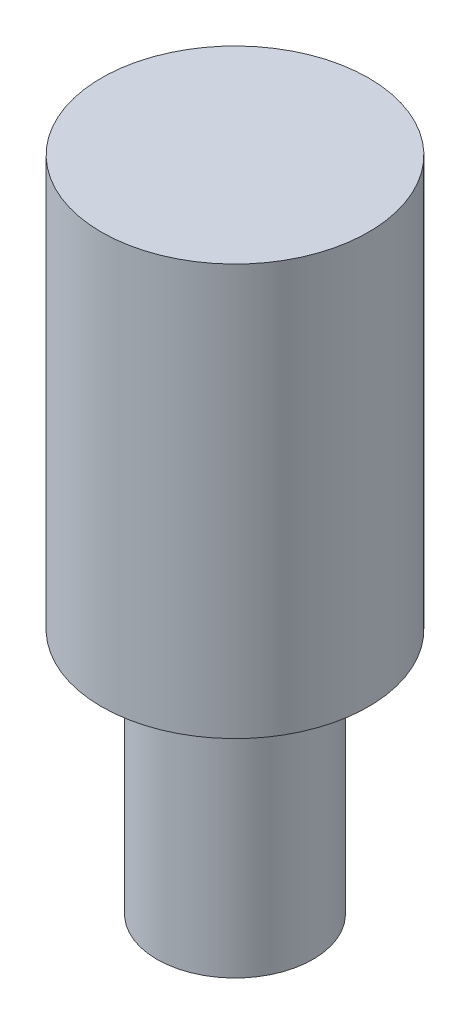
ISO-10303-21;
HEADER;
FILE_DESCRIPTION(('STEP AP214'),'2;1');
FILE_NAME('part.step','',(''),(''),'','','');
FILE_SCHEMA(('AUTOMOTIVE_DESIGN { 1 0 10303 214 1 1 1 1 }'));
ENDSEC;
DATA;
#1=APPLICATION_CONTEXT('core data for automotive mechanical design processes');
#2=APPLICATION_PROTOCOL_DEFINITION('international standard','automotive_design',2000,#1);
#3=PRODUCT_CONTEXT('',#1,'mechanical');
#4=PRODUCT('Part','Part','',(#3));
#5=PRODUCT_RELATED_PRODUCT_CATEGORY('part','',(#4));
#6=PRODUCT_DEFINITION_FORMATION('','',#4);
#7=PRODUCT_DEFINITION_CONTEXT('part definition',#1,'design');
#8=PRODUCT_DEFINITION('design','',#6,#7);
#9=PRODUCT_DEFINITION_SHAPE('','',#8);
#10=(LENGTH_UNIT() NAMED_UNIT(*) SI_UNIT(.MILLI.,.METRE.));
#11=(NAMED_UNIT(*) PLANE_ANGLE_UNIT() SI_UNIT($,.RADIAN.));
#12=(NAMED_UNIT(*) SI_UNIT($,.STERADIAN.) SOLID_ANGLE_UNIT());
#13=UNCERTAINTY_MEASURE_WITH_UNIT(LENGTH_MEASURE(1.E-05),#10,'distance_accuracy_value','');
#14=(GEOMETRIC_REPRESENTATION_CONTEXT(3) GLOBAL_UNCERTAINTY_ASSIGNED_CONTEXT((#13)) GLOBAL_UNIT_ASSIGNED_CONTEXT((#10,
#11,#12)) REPRESENTATION_CONTEXT('',''));
#15=CARTESIAN_POINT('',(0.,0.,0.));
#16=DIRECTION('',(0.,0.,1.));
#17=DIRECTION('',(1.,0.,0.));
#18=AXIS2_PLACEMENT_3D('',#15,#16,#17);
#19=CARTESIAN_POINT('',(0.,6.,0.));
#20=DIRECTION('',(0.,-1.,0.));
#21=DIRECTION('',(0.,0.,-1.));
#22=AXIS2_PLACEMENT_3D('',#19,#20,#21);
#23=CYLINDRICAL_SURFACE('',#22,1.9);
#24=CARTESIAN_POINT('',(0.,6.,0.));
#25=DIRECTION('',(0.,1.,0.));
#26=DIRECTION('',(0.,0.,1.));
#27=AXIS2_PLACEMENT_3D('',#24,#25,#26);
#28=CIRCLE('',#27,1.9);
#29=CARTESIAN_POINT('',(0.,6.,1.9));
#30=VERTEX_POINT('',#29);
#31=EDGE_CURVE('E10',#30,#30,#28,.T.);
#32=ORIENTED_EDGE('',*,*,#31,.F.);
#33=EDGE_LOOP('',(#32));
#34=FACE_BOUND('',#33,.T.);
#35=CARTESIAN_POINT('',(0.,0.,0.));
#36=DIRECTION('',(0.,1.,0.));
#37=DIRECTION('',(0.,0.,1.));
#38=AXIS2_PLACEMENT_3D('',#35,#36,#37);
#39=CIRCLE('',#38,1.9);
#40=CARTESIAN_POINT('',(0.,0.,1.9));
#41=VERTEX_POINT('',#40);
#42=EDGE_CURVE('E46',#41,#41,#39,.T.);
#43=ORIENTED_EDGE('',*,*,#42,.T.);
#44=EDGE_LOOP('',(#43));
#45=FACE_BOUND('',#44,.T.);
#46=ADVANCED_FACE('F43',(#34,#45),#23,.T.);
#47=CARTESIAN_POINT('',(0.,0.,0.));
#48=DIRECTION('',(0.,1.,0.));
#49=DIRECTION('',(0.,0.,1.));
#50=AXIS2_PLACEMENT_3D('',#47,#48,#49);
#51=PLANE('',#50);
#52=ORIENTED_EDGE('',*,*,#42,.F.);
#53=EDGE_LOOP('',(#52));
#54=FACE_BOUND('',#53,.T.);
#55=ADVANCED_FACE('F70',(#54),#51,.F.);
#56=CARTESIAN_POINT('',(0.,16.,0.));
#57=DIRECTION('',(0.,-1.,0.));
#58=DIRECTION('',(0.,0.,-1.));
#59=AXIS2_PLACEMENT_3D('',#56,#57,#58);
#60=CYLINDRICAL_SURFACE('',#59,3.25);
#61=CARTESIAN_POINT('',(0.,16.,0.));
#62=DIRECTION('',(0.,1.,0.));
#63=DIRECTION('',(0.,0.,1.));
#64=AXIS2_PLACEMENT_3D('',#61,#62,#63);
#65=CIRCLE('',#64,3.25);
#66=CARTESIAN_POINT('',(0.,16.,3.25));
#67=VERTEX_POINT('',#66);
#68=EDGE_CURVE('E55',#67,#67,#65,.T.);
#69=ORIENTED_EDGE('',*,*,#68,.F.);
#70=EDGE_LOOP('',(#69));
#71=FACE_BOUND('',#70,.T.);
#72=CARTESIAN_POINT('',(0.,6.,0.));
#73=DIRECTION('',(0.,1.,0.));
#74=DIRECTION('',(0.,0.,1.));
#75=AXIS2_PLACEMENT_3D('',#72,#73,#74);
#76=CIRCLE('',#75,3.25);
#77=CARTESIAN_POINT('',(0.,6.,3.25));
#78=VERTEX_POINT('',#77);
#79=EDGE_CURVE('E57',#78,#78,#76,.T.);
#80=ORIENTED_EDGE('',*,*,#79,.T.);
#81=EDGE_LOOP('',(#80));
#82=FACE_BOUND('',#81,.T.);
#83=ADVANCED_FACE('F67',(#71,#82),#60,.T.);
#84=CARTESIAN_POINT('',(0.,16.,0.));
#85=DIRECTION('',(0.,1.,0.));
#86=DIRECTION('',(0.,0.,1.));
#87=AXIS2_PLACEMENT_3D('',#84,#85,#86);
#88=PLANE('',#87);
#89=ORIENTED_EDGE('',*,*,#68,.T.);
#90=EDGE_LOOP('',(#89));
#91=FACE_BOUND('',#90,.T.);
#92=ADVANCED_FACE('F65',(#91),#88,.T.);
#93=CARTESIAN_POINT('',(0.,6.,0.));
#94=DIRECTION('',(0.,1.,0.));
#95=DIRECTION('',(0.,0.,1.));
#96=AXIS2_PLACEMENT_3D('',#93,#94,#95);
#97=PLANE('',#96);
#98=ORIENTED_EDGE('',*,*,#31,.T.);
#99=EDGE_LOOP('',(#98));
#100=FACE_BOUND('',#99,.T.);
#101=ORIENTED_EDGE('',*,*,#79,.F.);
#102=EDGE_LOOP('',(#101));
#103=FACE_BOUND('',#102,.T.);
#104=ADVANCED_FACE('F74',(#100,#103),#97,.F.);
#105=CLOSED_SHELL('',(#46,#55,#83,#92,#104));
#106=MANIFOLD_SOLID_BREP('B2',#105);
#107=ADVANCED_BREP_SHAPE_REPRESENTATION('',(#18,#106),#14);
#108=SHAPE_DEFINITION_REPRESENTATION(#9,#107);
ENDSEC;
END-ISO-10303-21;
